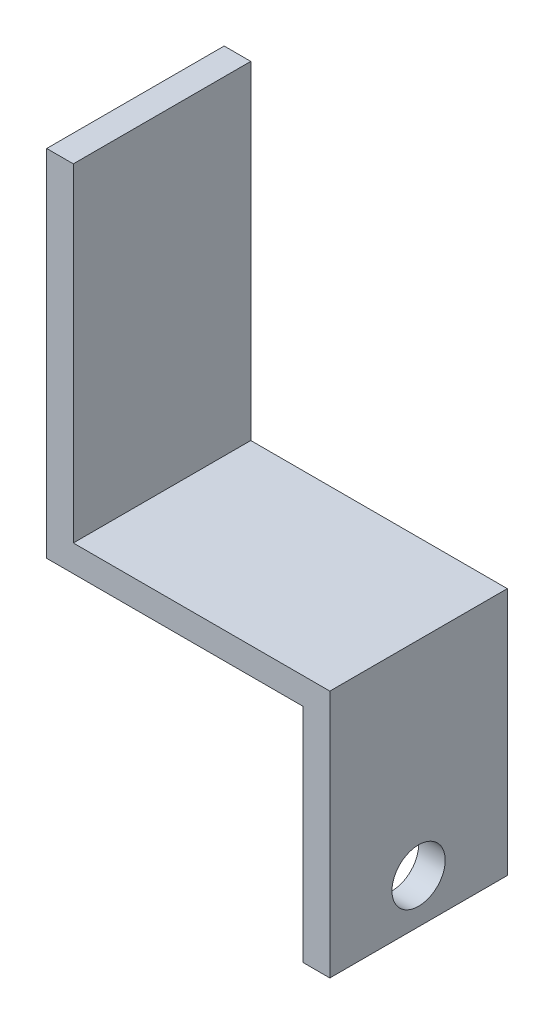
ISO-10303-21;
HEADER;
FILE_DESCRIPTION(('STEP AP214'),'2;1');
FILE_NAME('part.step','',(''),(''),'','','');
FILE_SCHEMA(('AUTOMOTIVE_DESIGN { 1 0 10303 214 1 1 1 1 }'));
ENDSEC;
DATA;
#1=APPLICATION_CONTEXT('core data for automotive mechanical design processes');
#2=APPLICATION_PROTOCOL_DEFINITION('international standard','automotive_design',2000,#1);
#3=PRODUCT_CONTEXT('',#1,'mechanical');
#4=PRODUCT('Part','Part','',(#3));
#5=PRODUCT_RELATED_PRODUCT_CATEGORY('part','',(#4));
#6=PRODUCT_DEFINITION_FORMATION('','',#4);
#7=PRODUCT_DEFINITION_CONTEXT('part definition',#1,'design');
#8=PRODUCT_DEFINITION('design','',#6,#7);
#9=PRODUCT_DEFINITION_SHAPE('','',#8);
#10=(LENGTH_UNIT() NAMED_UNIT(*) SI_UNIT(.MILLI.,.METRE.));
#11=(NAMED_UNIT(*) PLANE_ANGLE_UNIT() SI_UNIT($,.RADIAN.));
#12=(NAMED_UNIT(*) SI_UNIT($,.STERADIAN.) SOLID_ANGLE_UNIT());
#13=UNCERTAINTY_MEASURE_WITH_UNIT(LENGTH_MEASURE(1.E-05),#10,'distance_accuracy_value','');
#14=(GEOMETRIC_REPRESENTATION_CONTEXT(3) GLOBAL_UNCERTAINTY_ASSIGNED_CONTEXT((#13)) GLOBAL_UNIT_ASSIGNED_CONTEXT((#10,
#11,#12)) REPRESENTATION_CONTEXT('',''));
#15=CARTESIAN_POINT('',(0.,0.,0.));
#16=DIRECTION('',(0.,0.,1.));
#17=DIRECTION('',(1.,0.,0.));
#18=AXIS2_PLACEMENT_3D('',#15,#16,#17);
#19=CARTESIAN_POINT('',(-3.,-2.99904794399357,20.));
#20=DIRECTION('',(0.,1.,0.));
#21=DIRECTION('',(-1.,0.,0.));
#22=AXIS2_PLACEMENT_3D('',#19,#20,#21);
#23=PLANE('',#22);
#24=DIRECTION('',(1.,0.,0.));
#25=VECTOR('',#24,1.);
#26=CARTESIAN_POINT('',(-3.,-2.99904794399357,0.));
#27=LINE('',#26,#25);
#28=CARTESIAN_POINT('',(-31.9076229249202,-2.99904794399357,0.));
#29=VERTEX_POINT('',#28);
#30=CARTESIAN_POINT('',(-3.,-2.99904794399357,0.));
#31=VERTEX_POINT('',#30);
#32=EDGE_CURVE('E131',#29,#31,#27,.T.);
#33=ORIENTED_EDGE('',*,*,#32,.T.);
#34=DIRECTION('',(0.,0.,-1.));
#35=VECTOR('',#34,1.);
#36=CARTESIAN_POINT('',(-3.,-2.99904794399357,20.));
#37=LINE('',#36,#35);
#38=CARTESIAN_POINT('',(-3.,-2.99904794399357,20.));
#39=VERTEX_POINT('',#38);
#40=EDGE_CURVE('E11',#39,#31,#37,.T.);
#41=ORIENTED_EDGE('',*,*,#40,.F.);
#42=DIRECTION('',(1.,0.,0.));
#43=VECTOR('',#42,1.);
#44=CARTESIAN_POINT('',(-3.,-2.99904794399357,20.));
#45=LINE('',#44,#43);
#46=CARTESIAN_POINT('',(-31.9076229249202,-2.99904794399357,20.));
#47=VERTEX_POINT('',#46);
#48=EDGE_CURVE('E146',#47,#39,#45,.T.);
#49=ORIENTED_EDGE('',*,*,#48,.F.);
#50=DIRECTION('',(0.,0.,-1.));
#51=VECTOR('',#50,1.);
#52=CARTESIAN_POINT('',(-31.9076229249202,-2.99904794399357,20.));
#53=LINE('',#52,#51);
#54=EDGE_CURVE('E127',#47,#29,#53,.T.);
#55=ORIENTED_EDGE('',*,*,#54,.T.);
#56=EDGE_LOOP('',(#33,#41,#49,#55));
#57=FACE_BOUND('',#56,.T.);
#58=ADVANCED_FACE('F35',(#57),#23,.F.);
#59=CARTESIAN_POINT('',(-3.,-2.99904794399357,20.));
#60=DIRECTION('',(1.,0.,0.));
#61=DIRECTION('',(0.,1.,0.));
#62=AXIS2_PLACEMENT_3D('',#59,#60,#61);
#63=PLANE('',#62);
#64=CARTESIAN_POINT('',(-3.,-22.9990479439936,10.));
#65=DIRECTION('',(1.,0.,0.));
#66=DIRECTION('',(0.,1.,0.));
#67=AXIS2_PLACEMENT_3D('',#64,#65,#66);
#68=CIRCLE('',#67,3.);
#69=CARTESIAN_POINT('',(-3.,-19.9990479439936,10.));
#70=VERTEX_POINT('',#69);
#71=EDGE_CURVE('E135',#70,#70,#68,.T.);
#72=ORIENTED_EDGE('',*,*,#71,.T.);
#73=EDGE_LOOP('',(#72));
#74=FACE_BOUND('',#73,.T.);
#75=DIRECTION('',(0.,-1.,0.));
#76=VECTOR('',#75,1.);
#77=CARTESIAN_POINT('',(-3.,-2.99904794399357,0.));
#78=LINE('',#77,#76);
#79=CARTESIAN_POINT('',(-3.,-27.9990479439936,0.));
#80=VERTEX_POINT('',#79);
#81=EDGE_CURVE('E134',#31,#80,#78,.T.);
#82=ORIENTED_EDGE('',*,*,#81,.T.);
#83=DIRECTION('',(0.,0.,-1.));
#84=VECTOR('',#83,1.);
#85=CARTESIAN_POINT('',(-3.,-27.9990479439936,20.));
#86=LINE('',#85,#84);
#87=CARTESIAN_POINT('',(-3.,-27.9990479439936,20.));
#88=VERTEX_POINT('',#87);
#89=EDGE_CURVE('E43',#88,#80,#86,.T.);
#90=ORIENTED_EDGE('',*,*,#89,.F.);
#91=DIRECTION('',(0.,-1.,0.));
#92=VECTOR('',#91,1.);
#93=CARTESIAN_POINT('',(-3.,-2.99904794399357,20.));
#94=LINE('',#93,#92);
#95=EDGE_CURVE('E94',#39,#88,#94,.T.);
#96=ORIENTED_EDGE('',*,*,#95,.F.);
#97=ORIENTED_EDGE('',*,*,#40,.T.);
#98=EDGE_LOOP('',(#82,#90,#96,#97));
#99=FACE_BOUND('',#98,.T.);
#100=ADVANCED_FACE('F185',(#74,#99),#63,.F.);
#101=CARTESIAN_POINT('',(0.,-27.9990479439936,20.));
#102=DIRECTION('',(0.,1.,0.));
#103=DIRECTION('',(0.,0.,1.));
#104=AXIS2_PLACEMENT_3D('',#101,#102,#103);
#105=PLANE('',#104);
#106=DIRECTION('',(1.,0.,0.));
#107=VECTOR('',#106,1.);
#108=CARTESIAN_POINT('',(0.,-27.9990479439936,0.));
#109=LINE('',#108,#107);
#110=CARTESIAN_POINT('',(0.,-27.9990479439936,0.));
#111=VERTEX_POINT('',#110);
#112=EDGE_CURVE('E137',#80,#111,#109,.T.);
#113=ORIENTED_EDGE('',*,*,#112,.T.);
#114=DIRECTION('',(0.,0.,-1.));
#115=VECTOR('',#114,1.);
#116=CARTESIAN_POINT('',(0.,-27.9990479439936,20.));
#117=LINE('',#116,#115);
#118=CARTESIAN_POINT('',(0.,-27.9990479439936,20.));
#119=VERTEX_POINT('',#118);
#120=EDGE_CURVE('E153',#119,#111,#117,.T.);
#121=ORIENTED_EDGE('',*,*,#120,.F.);
#122=DIRECTION('',(1.,0.,0.));
#123=VECTOR('',#122,1.);
#124=CARTESIAN_POINT('',(0.,-27.9990479439936,20.));
#125=LINE('',#124,#123);
#126=EDGE_CURVE('E161',#88,#119,#125,.T.);
#127=ORIENTED_EDGE('',*,*,#126,.F.);
#128=ORIENTED_EDGE('',*,*,#89,.T.);
#129=EDGE_LOOP('',(#113,#121,#127,#128));
#130=FACE_BOUND('',#129,.T.);
#131=ADVANCED_FACE('F159',(#130),#105,.F.);
#132=CARTESIAN_POINT('',(0.,0.,20.));
#133=DIRECTION('',(-1.,0.,0.));
#134=DIRECTION('',(0.,-1.,0.));
#135=AXIS2_PLACEMENT_3D('',#132,#133,#134);
#136=PLANE('',#135);
#137=CARTESIAN_POINT('',(0.,-22.9990479439936,10.));
#138=DIRECTION('',(1.,0.,0.));
#139=DIRECTION('',(0.,1.,0.));
#140=AXIS2_PLACEMENT_3D('',#137,#138,#139);
#141=CIRCLE('',#140,3.);
#142=CARTESIAN_POINT('',(0.,-19.9990479439936,10.));
#143=VERTEX_POINT('',#142);
#144=EDGE_CURVE('E179',#143,#143,#141,.T.);
#145=ORIENTED_EDGE('',*,*,#144,.F.);
#146=EDGE_LOOP('',(#145));
#147=FACE_BOUND('',#146,.T.);
#148=DIRECTION('',(0.,1.,0.));
#149=VECTOR('',#148,1.);
#150=CARTESIAN_POINT('',(0.,0.,0.));
#151=LINE('',#150,#149);
#152=CARTESIAN_POINT('',(0.,0.,0.));
#153=VERTEX_POINT('',#152);
#154=EDGE_CURVE('E139',#111,#153,#151,.T.);
#155=ORIENTED_EDGE('',*,*,#154,.T.);
#156=DIRECTION('',(0.,0.,-1.));
#157=VECTOR('',#156,1.);
#158=CARTESIAN_POINT('',(0.,0.,20.));
#159=LINE('',#158,#157);
#160=CARTESIAN_POINT('',(0.,0.,20.));
#161=VERTEX_POINT('',#160);
#162=EDGE_CURVE('E150',#161,#153,#159,.T.);
#163=ORIENTED_EDGE('',*,*,#162,.F.);
#164=DIRECTION('',(0.,1.,0.));
#165=VECTOR('',#164,1.);
#166=CARTESIAN_POINT('',(0.,0.,20.));
#167=LINE('',#166,#165);
#168=EDGE_CURVE('E173',#119,#161,#167,.T.);
#169=ORIENTED_EDGE('',*,*,#168,.F.);
#170=ORIENTED_EDGE('',*,*,#120,.T.);
#171=EDGE_LOOP('',(#155,#163,#169,#170));
#172=FACE_BOUND('',#171,.T.);
#173=ADVANCED_FACE('F169',(#147,#172),#136,.F.);
#174=CARTESIAN_POINT('',(-28.9076229249202,0.,20.));
#175=DIRECTION('',(0.,-1.,0.));
#176=DIRECTION('',(0.,0.,-1.));
#177=AXIS2_PLACEMENT_3D('',#174,#175,#176);
#178=PLANE('',#177);
#179=DIRECTION('',(-1.,0.,0.));
#180=VECTOR('',#179,1.);
#181=CARTESIAN_POINT('',(-28.9076229249202,0.,0.));
#182=LINE('',#181,#180);
#183=CARTESIAN_POINT('',(-28.9076229249202,0.,0.));
#184=VERTEX_POINT('',#183);
#185=EDGE_CURVE('E141',#153,#184,#182,.T.);
#186=ORIENTED_EDGE('',*,*,#185,.T.);
#187=DIRECTION('',(0.,0.,-1.));
#188=VECTOR('',#187,1.);
#189=CARTESIAN_POINT('',(-28.9076229249202,0.,20.));
#190=LINE('',#189,#188);
#191=CARTESIAN_POINT('',(-28.9076229249202,0.,20.));
#192=VERTEX_POINT('',#191);
#193=EDGE_CURVE('E122',#192,#184,#190,.T.);
#194=ORIENTED_EDGE('',*,*,#193,.F.);
#195=DIRECTION('',(-1.,0.,0.));
#196=VECTOR('',#195,1.);
#197=CARTESIAN_POINT('',(-28.9076229249202,0.,20.));
#198=LINE('',#197,#196);
#199=EDGE_CURVE('E113',#161,#192,#198,.T.);
#200=ORIENTED_EDGE('',*,*,#199,.F.);
#201=ORIENTED_EDGE('',*,*,#162,.T.);
#202=EDGE_LOOP('',(#186,#194,#200,#201));
#203=FACE_BOUND('',#202,.T.);
#204=ADVANCED_FACE('F172',(#203),#178,.F.);
#205=CARTESIAN_POINT('',(-28.9076229249202,0.,20.));
#206=DIRECTION('',(-1.,0.,0.));
#207=DIRECTION('',(0.,0.,1.));
#208=AXIS2_PLACEMENT_3D('',#205,#206,#207);
#209=PLANE('',#208);
#210=DIRECTION('',(0.,1.,0.));
#211=VECTOR('',#210,1.);
#212=CARTESIAN_POINT('',(-28.9076229249202,0.,0.));
#213=LINE('',#212,#211);
#214=CARTESIAN_POINT('',(-28.9076229249202,37.0009520560064,0.));
#215=VERTEX_POINT('',#214);
#216=EDGE_CURVE('E121',#184,#215,#213,.T.);
#217=ORIENTED_EDGE('',*,*,#216,.T.);
#218=DIRECTION('',(0.,0.,-1.));
#219=VECTOR('',#218,1.);
#220=CARTESIAN_POINT('',(-28.9076229249202,37.0009520560064,20.));
#221=LINE('',#220,#219);
#222=CARTESIAN_POINT('',(-28.9076229249202,37.0009520560064,20.));
#223=VERTEX_POINT('',#222);
#224=EDGE_CURVE('E118',#223,#215,#221,.T.);
#225=ORIENTED_EDGE('',*,*,#224,.F.);
#226=DIRECTION('',(0.,1.,0.));
#227=VECTOR('',#226,1.);
#228=CARTESIAN_POINT('',(-28.9076229249202,0.,20.));
#229=LINE('',#228,#227);
#230=EDGE_CURVE('E107',#192,#223,#229,.T.);
#231=ORIENTED_EDGE('',*,*,#230,.F.);
#232=ORIENTED_EDGE('',*,*,#193,.T.);
#233=EDGE_LOOP('',(#217,#225,#231,#232));
#234=FACE_BOUND('',#233,.T.);
#235=ADVANCED_FACE('F119',(#234),#209,.F.);
#236=CARTESIAN_POINT('',(-28.9076229249202,37.0009520560064,20.));
#237=DIRECTION('',(0.,-1.,0.));
#238=DIRECTION('',(0.,0.,-1.));
#239=AXIS2_PLACEMENT_3D('',#236,#237,#238);
#240=PLANE('',#239);
#241=DIRECTION('',(-1.,0.,0.));
#242=VECTOR('',#241,1.);
#243=CARTESIAN_POINT('',(-28.9076229249202,37.0009520560064,0.));
#244=LINE('',#243,#242);
#245=CARTESIAN_POINT('',(-31.9076229249202,37.0009520560064,0.));
#246=VERTEX_POINT('',#245);
#247=EDGE_CURVE('E80',#215,#246,#244,.T.);
#248=ORIENTED_EDGE('',*,*,#247,.T.);
#249=DIRECTION('',(0.,0.,-1.));
#250=VECTOR('',#249,1.);
#251=CARTESIAN_POINT('',(-31.9076229249202,37.0009520560064,20.));
#252=LINE('',#251,#250);
#253=CARTESIAN_POINT('',(-31.9076229249202,37.0009520560064,20.));
#254=VERTEX_POINT('',#253);
#255=EDGE_CURVE('E123',#254,#246,#252,.T.);
#256=ORIENTED_EDGE('',*,*,#255,.F.);
#257=DIRECTION('',(-1.,0.,0.));
#258=VECTOR('',#257,1.);
#259=CARTESIAN_POINT('',(-28.9076229249202,37.0009520560064,20.));
#260=LINE('',#259,#258);
#261=EDGE_CURVE('E111',#223,#254,#260,.T.);
#262=ORIENTED_EDGE('',*,*,#261,.F.);
#263=ORIENTED_EDGE('',*,*,#224,.T.);
#264=EDGE_LOOP('',(#248,#256,#262,#263));
#265=FACE_BOUND('',#264,.T.);
#266=ADVANCED_FACE('F125',(#265),#240,.F.);
#267=CARTESIAN_POINT('',(-31.9076229249202,-2.99904794399357,20.));
#268=DIRECTION('',(1.,0.,0.));
#269=DIRECTION('',(0.,0.,-1.));
#270=AXIS2_PLACEMENT_3D('',#267,#268,#269);
#271=PLANE('',#270);
#272=DIRECTION('',(0.,-1.,0.));
#273=VECTOR('',#272,1.);
#274=CARTESIAN_POINT('',(-31.9076229249202,-2.99904794399357,0.));
#275=LINE('',#274,#273);
#276=EDGE_CURVE('E86',#246,#29,#275,.T.);
#277=ORIENTED_EDGE('',*,*,#276,.T.);
#278=ORIENTED_EDGE('',*,*,#54,.F.);
#279=DIRECTION('',(0.,-1.,0.));
#280=VECTOR('',#279,1.);
#281=CARTESIAN_POINT('',(-31.9076229249202,-2.99904794399357,20.));
#282=LINE('',#281,#280);
#283=EDGE_CURVE('E51',#254,#47,#282,.T.);
#284=ORIENTED_EDGE('',*,*,#283,.F.);
#285=ORIENTED_EDGE('',*,*,#255,.T.);
#286=EDGE_LOOP('',(#277,#278,#284,#285));
#287=FACE_BOUND('',#286,.T.);
#288=ADVANCED_FACE('F208',(#287),#271,.F.);
#289=CARTESIAN_POINT('',(0.,0.,20.));
#290=DIRECTION('',(0.,0.,-1.));
#291=DIRECTION('',(-1.,0.,0.));
#292=AXIS2_PLACEMENT_3D('',#289,#290,#291);
#293=PLANE('',#292);
#294=ORIENTED_EDGE('',*,*,#48,.T.);
#295=ORIENTED_EDGE('',*,*,#95,.T.);
#296=ORIENTED_EDGE('',*,*,#126,.T.);
#297=ORIENTED_EDGE('',*,*,#168,.T.);
#298=ORIENTED_EDGE('',*,*,#199,.T.);
#299=ORIENTED_EDGE('',*,*,#230,.T.);
#300=ORIENTED_EDGE('',*,*,#261,.T.);
#301=ORIENTED_EDGE('',*,*,#283,.T.);
#302=EDGE_LOOP('',(#294,#295,#296,#297,#298,#299,#300,#301));
#303=FACE_BOUND('',#302,.T.);
#304=ADVANCED_FACE('F109',(#303),#293,.F.);
#305=CARTESIAN_POINT('',(0.,0.,0.));
#306=DIRECTION('',(0.,0.,-1.));
#307=DIRECTION('',(-1.,0.,0.));
#308=AXIS2_PLACEMENT_3D('',#305,#306,#307);
#309=PLANE('',#308);
#310=ORIENTED_EDGE('',*,*,#32,.F.);
#311=ORIENTED_EDGE('',*,*,#276,.F.);
#312=ORIENTED_EDGE('',*,*,#247,.F.);
#313=ORIENTED_EDGE('',*,*,#216,.F.);
#314=ORIENTED_EDGE('',*,*,#185,.F.);
#315=ORIENTED_EDGE('',*,*,#154,.F.);
#316=ORIENTED_EDGE('',*,*,#112,.F.);
#317=ORIENTED_EDGE('',*,*,#81,.F.);
#318=EDGE_LOOP('',(#310,#311,#312,#313,#314,#315,#316,#317));
#319=FACE_BOUND('',#318,.T.);
#320=ADVANCED_FACE('F165',(#319),#309,.T.);
#321=CARTESIAN_POINT('',(-3.,-22.9990479439936,10.));
#322=DIRECTION('',(1.,0.,0.));
#323=DIRECTION('',(0.,1.,0.));
#324=AXIS2_PLACEMENT_3D('',#321,#322,#323);
#325=CYLINDRICAL_SURFACE('',#324,3.);
#326=ORIENTED_EDGE('',*,*,#71,.F.);
#327=EDGE_LOOP('',(#326));
#328=FACE_BOUND('',#327,.T.);
#329=ORIENTED_EDGE('',*,*,#144,.T.);
#330=EDGE_LOOP('',(#329));
#331=FACE_BOUND('',#330,.T.);
#332=ADVANCED_FACE('F187',(#328,#331),#325,.F.);
#333=CLOSED_SHELL('',(#58,#100,#131,#173,#204,#235,#266,#288,#304,#320,#332));
#334=MANIFOLD_SOLID_BREP('B2',#333);
#335=ADVANCED_BREP_SHAPE_REPRESENTATION('',(#18,#334),#14);
#336=SHAPE_DEFINITION_REPRESENTATION(#9,#335);
ENDSEC;
END-ISO-10303-21;
